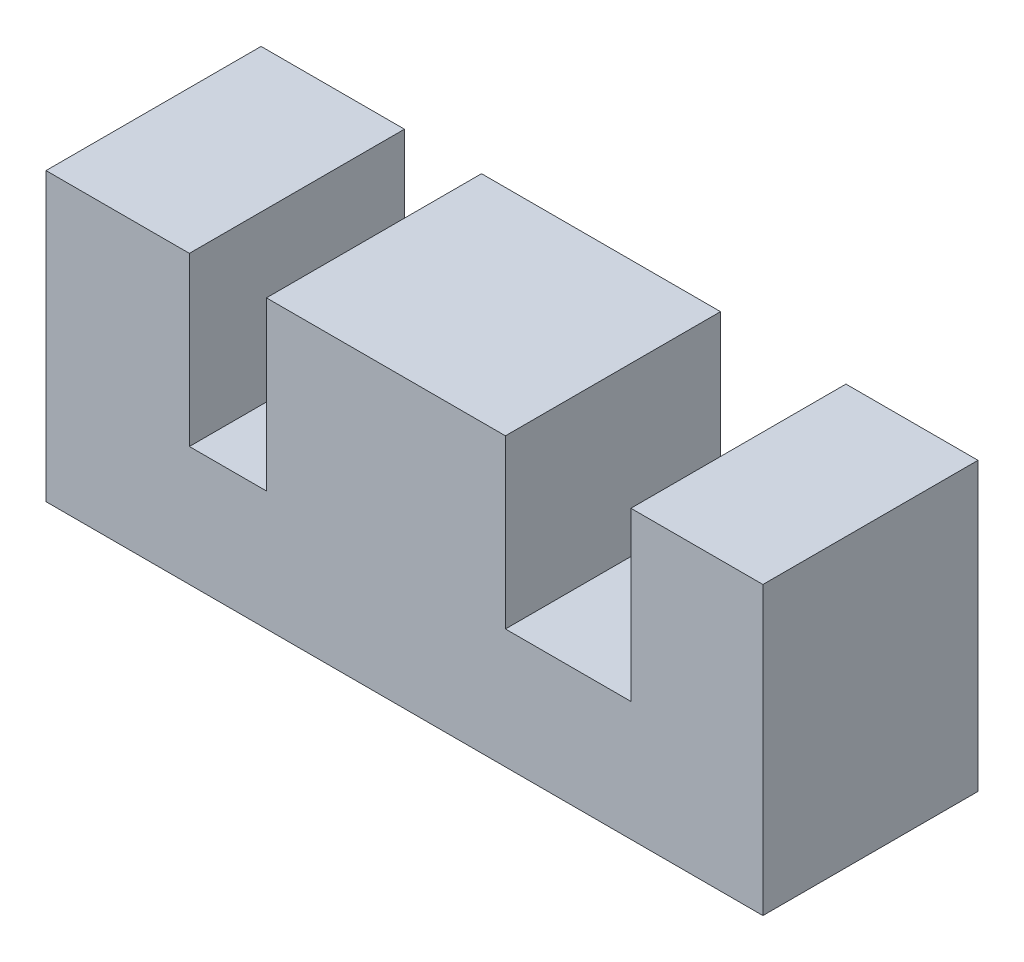
ISO-10303-21;
HEADER;
FILE_DESCRIPTION(('STEP AP214'),'2;1');
FILE_NAME('part.step','',(''),(''),'','','');
FILE_SCHEMA(('AUTOMOTIVE_DESIGN { 1 0 10303 214 1 1 1 1 }'));
ENDSEC;
DATA;
#1=APPLICATION_CONTEXT('core data for automotive mechanical design processes');
#2=APPLICATION_PROTOCOL_DEFINITION('international standard','automotive_design',2000,#1);
#3=PRODUCT_CONTEXT('',#1,'mechanical');
#4=PRODUCT('Part','Part','',(#3));
#5=PRODUCT_RELATED_PRODUCT_CATEGORY('part','',(#4));
#6=PRODUCT_DEFINITION_FORMATION('','',#4);
#7=PRODUCT_DEFINITION_CONTEXT('part definition',#1,'design');
#8=PRODUCT_DEFINITION('design','',#6,#7);
#9=PRODUCT_DEFINITION_SHAPE('','',#8);
#10=(LENGTH_UNIT() NAMED_UNIT(*) SI_UNIT(.MILLI.,.METRE.));
#11=(NAMED_UNIT(*) PLANE_ANGLE_UNIT() SI_UNIT($,.RADIAN.));
#12=(NAMED_UNIT(*) SI_UNIT($,.STERADIAN.) SOLID_ANGLE_UNIT());
#13=UNCERTAINTY_MEASURE_WITH_UNIT(LENGTH_MEASURE(1.E-05),#10,'distance_accuracy_value','');
#14=(GEOMETRIC_REPRESENTATION_CONTEXT(3) GLOBAL_UNCERTAINTY_ASSIGNED_CONTEXT((#13)) GLOBAL_UNIT_ASSIGNED_CONTEXT((#10,
#11,#12)) REPRESENTATION_CONTEXT('',''));
#15=CARTESIAN_POINT('',(0.,0.,0.));
#16=DIRECTION('',(0.,0.,1.));
#17=DIRECTION('',(1.,0.,0.));
#18=AXIS2_PLACEMENT_3D('',#15,#16,#17);
#19=CARTESIAN_POINT('',(0.,10.,0.));
#20=DIRECTION('',(0.,1.,0.));
#21=DIRECTION('',(0.,0.,1.));
#22=AXIS2_PLACEMENT_3D('',#19,#20,#21);
#23=PLANE('',#22);
#24=DIRECTION('',(1.,0.,0.));
#25=VECTOR('',#24,1.);
#26=CARTESIAN_POINT('',(-36.9298245614035,10.,8.21929824561403));
#27=LINE('',#26,#25);
#28=CARTESIAN_POINT('',(1.52017543859649,10.,8.21929824561403));
#29=VERTEX_POINT('',#28);
#30=CARTESIAN_POINT('',(12.0201754385965,10.,8.21929824561403));
#31=VERTEX_POINT('',#30);
#32=EDGE_CURVE('E48',#29,#31,#27,.T.);
#33=ORIENTED_EDGE('',*,*,#32,.T.);
#34=DIRECTION('',(0.,0.,1.));
#35=VECTOR('',#34,1.);
#36=CARTESIAN_POINT('',(12.0201754385965,10.,8.21929824561404));
#37=LINE('',#36,#35);
#38=CARTESIAN_POINT('',(12.0201754385965,10.,-9.78070175438596));
#39=VERTEX_POINT('',#38);
#40=EDGE_CURVE('E148',#39,#31,#37,.T.);
#41=ORIENTED_EDGE('',*,*,#40,.F.);
#42=DIRECTION('',(-1.,0.,0.));
#43=VECTOR('',#42,1.);
#44=CARTESIAN_POINT('',(-36.9298245614035,10.,-9.78070175438596));
#45=LINE('',#44,#43);
#46=CARTESIAN_POINT('',(1.5201754385965,10.,-9.78070175438596));
#47=VERTEX_POINT('',#46);
#48=EDGE_CURVE('E206',#39,#47,#45,.T.);
#49=ORIENTED_EDGE('',*,*,#48,.T.);
#50=DIRECTION('',(0.,0.,-1.));
#51=VECTOR('',#50,1.);
#52=CARTESIAN_POINT('',(1.52017543859649,10.,8.21929824561403));
#53=LINE('',#52,#51);
#54=EDGE_CURVE('E158',#29,#47,#53,.T.);
#55=ORIENTED_EDGE('',*,*,#54,.F.);
#56=EDGE_LOOP('',(#33,#41,#49,#55));
#57=FACE_BOUND('',#56,.T.);
#58=ADVANCED_FACE('F33',(#57),#23,.T.);
#59=CARTESIAN_POINT('',(-24.9298245614035,10.,8.21929824561403));
#60=VERTEX_POINT('',#59);
#61=CARTESIAN_POINT('',(-18.4798245614035,10.,8.21929824561403));
#62=VERTEX_POINT('',#61);
#63=EDGE_CURVE('E203',#60,#62,#27,.T.);
#64=ORIENTED_EDGE('',*,*,#63,.T.);
#65=DIRECTION('',(0.,0.,1.));
#66=VECTOR('',#65,1.);
#67=CARTESIAN_POINT('',(-18.4798245614035,10.,8.21929824561404));
#68=LINE('',#67,#66);
#69=CARTESIAN_POINT('',(-18.4798245614035,10.,-9.78070175438596));
#70=VERTEX_POINT('',#69);
#71=EDGE_CURVE('E56',#70,#62,#68,.T.);
#72=ORIENTED_EDGE('',*,*,#71,.F.);
#73=CARTESIAN_POINT('',(-24.9298245614035,10.,-9.78070175438596));
#74=VERTEX_POINT('',#73);
#75=EDGE_CURVE('E205',#70,#74,#45,.T.);
#76=ORIENTED_EDGE('',*,*,#75,.T.);
#77=DIRECTION('',(0.,0.,-1.));
#78=VECTOR('',#77,1.);
#79=CARTESIAN_POINT('',(-24.9298245614035,10.,8.21929824561403));
#80=LINE('',#79,#78);
#81=EDGE_CURVE('E183',#60,#74,#80,.T.);
#82=ORIENTED_EDGE('',*,*,#81,.F.);
#83=EDGE_LOOP('',(#64,#72,#76,#82));
#84=FACE_BOUND('',#83,.T.);
#85=ADVANCED_FACE('F233',(#84),#23,.T.);
#86=CARTESIAN_POINT('',(-36.9298245614035,10.,-9.78070175438596));
#87=DIRECTION('',(1.,0.,0.));
#88=DIRECTION('',(0.,0.,-1.));
#89=AXIS2_PLACEMENT_3D('',#86,#87,#88);
#90=PLANE('',#89);
#91=DIRECTION('',(0.,0.,1.));
#92=VECTOR('',#91,1.);
#93=CARTESIAN_POINT('',(-36.9298245614035,0.,-9.78070175438596));
#94=LINE('',#93,#92);
#95=CARTESIAN_POINT('',(-36.9298245614035,0.,-9.78070175438596));
#96=VERTEX_POINT('',#95);
#97=CARTESIAN_POINT('',(-36.9298245614035,0.,8.21929824561403));
#98=VERTEX_POINT('',#97);
#99=EDGE_CURVE('E202',#96,#98,#94,.T.);
#100=ORIENTED_EDGE('',*,*,#99,.T.);
#101=DIRECTION('',(0.,-1.,0.));
#102=VECTOR('',#101,1.);
#103=CARTESIAN_POINT('',(-36.9298245614035,10.,8.21929824561403));
#104=LINE('',#103,#102);
#105=CARTESIAN_POINT('',(-36.9298245614035,24.,8.21929824561403));
#106=VERTEX_POINT('',#105);
#107=EDGE_CURVE('E11',#106,#98,#104,.T.);
#108=ORIENTED_EDGE('',*,*,#107,.F.);
#109=DIRECTION('',(0.,0.,1.));
#110=VECTOR('',#109,1.);
#111=CARTESIAN_POINT('',(-36.9298245614035,24.,8.21929824561403));
#112=LINE('',#111,#110);
#113=CARTESIAN_POINT('',(-36.9298245614035,24.,-9.78070175438596));
#114=VERTEX_POINT('',#113);
#115=EDGE_CURVE('E184',#114,#106,#112,.T.);
#116=ORIENTED_EDGE('',*,*,#115,.F.);
#117=DIRECTION('',(0.,-1.,0.));
#118=VECTOR('',#117,1.);
#119=CARTESIAN_POINT('',(-36.9298245614035,10.,-9.78070175438596));
#120=LINE('',#119,#118);
#121=EDGE_CURVE('E133',#114,#96,#120,.T.);
#122=ORIENTED_EDGE('',*,*,#121,.T.);
#123=EDGE_LOOP('',(#100,#108,#116,#122));
#124=FACE_BOUND('',#123,.T.);
#125=ADVANCED_FACE('F35',(#124),#90,.F.);
#126=CARTESIAN_POINT('',(-36.9298245614035,10.,8.21929824561403));
#127=DIRECTION('',(0.,0.,-1.));
#128=DIRECTION('',(-1.,0.,0.));
#129=AXIS2_PLACEMENT_3D('',#126,#127,#128);
#130=PLANE('',#129);
#131=DIRECTION('',(1.,0.,0.));
#132=VECTOR('',#131,1.);
#133=CARTESIAN_POINT('',(-36.9298245614035,0.,8.21929824561403));
#134=LINE('',#133,#132);
#135=CARTESIAN_POINT('',(23.0701754385965,0.,8.21929824561403));
#136=VERTEX_POINT('',#135);
#137=EDGE_CURVE('E210',#98,#136,#134,.T.);
#138=ORIENTED_EDGE('',*,*,#137,.T.);
#139=DIRECTION('',(0.,-1.,0.));
#140=VECTOR('',#139,1.);
#141=CARTESIAN_POINT('',(23.0701754385965,10.,8.21929824561403));
#142=LINE('',#141,#140);
#143=CARTESIAN_POINT('',(23.0701754385965,24.,8.21929824561403));
#144=VERTEX_POINT('',#143);
#145=EDGE_CURVE('E41',#144,#136,#142,.T.);
#146=ORIENTED_EDGE('',*,*,#145,.F.);
#147=DIRECTION('',(1.,0.,0.));
#148=VECTOR('',#147,1.);
#149=CARTESIAN_POINT('',(23.0701754385965,24.,8.21929824561403));
#150=LINE('',#149,#148);
#151=CARTESIAN_POINT('',(12.0201754385965,24.,8.21929824561404));
#152=VERTEX_POINT('',#151);
#153=EDGE_CURVE('E147',#152,#144,#150,.T.);
#154=ORIENTED_EDGE('',*,*,#153,.F.);
#155=DIRECTION('',(0.,-1.,0.));
#156=VECTOR('',#155,1.);
#157=CARTESIAN_POINT('',(12.0201754385965,24.,8.21929824561404));
#158=LINE('',#157,#156);
#159=EDGE_CURVE('E153',#152,#31,#158,.T.);
#160=ORIENTED_EDGE('',*,*,#159,.T.);
#161=ORIENTED_EDGE('',*,*,#32,.F.);
#162=DIRECTION('',(0.,-1.,0.));
#163=VECTOR('',#162,1.);
#164=CARTESIAN_POINT('',(1.52017543859649,24.,8.21929824561403));
#165=LINE('',#164,#163);
#166=CARTESIAN_POINT('',(1.52017543859649,24.,8.21929824561403));
#167=VERTEX_POINT('',#166);
#168=EDGE_CURVE('E168',#167,#29,#165,.T.);
#169=ORIENTED_EDGE('',*,*,#168,.F.);
#170=DIRECTION('',(1.,0.,0.));
#171=VECTOR('',#170,1.);
#172=CARTESIAN_POINT('',(1.52017543859649,24.,8.21929824561403));
#173=LINE('',#172,#171);
#174=CARTESIAN_POINT('',(-18.4798245614035,24.,8.21929824561404));
#175=VERTEX_POINT('',#174);
#176=EDGE_CURVE('E166',#175,#167,#173,.T.);
#177=ORIENTED_EDGE('',*,*,#176,.F.);
#178=DIRECTION('',(0.,-1.,0.));
#179=VECTOR('',#178,1.);
#180=CARTESIAN_POINT('',(-18.4798245614035,24.,8.21929824561404));
#181=LINE('',#180,#179);
#182=EDGE_CURVE('E174',#175,#62,#181,.T.);
#183=ORIENTED_EDGE('',*,*,#182,.T.);
#184=ORIENTED_EDGE('',*,*,#63,.F.);
#185=DIRECTION('',(0.,-1.,0.));
#186=VECTOR('',#185,1.);
#187=CARTESIAN_POINT('',(-24.9298245614035,24.,8.21929824561403));
#188=LINE('',#187,#186);
#189=CARTESIAN_POINT('',(-24.9298245614035,24.,8.21929824561403));
#190=VERTEX_POINT('',#189);
#191=EDGE_CURVE('E199',#190,#60,#188,.T.);
#192=ORIENTED_EDGE('',*,*,#191,.F.);
#193=DIRECTION('',(1.,0.,0.));
#194=VECTOR('',#193,1.);
#195=CARTESIAN_POINT('',(-36.9298245614035,24.,8.21929824561403));
#196=LINE('',#195,#194);
#197=EDGE_CURVE('E187',#106,#190,#196,.T.);
#198=ORIENTED_EDGE('',*,*,#197,.F.);
#199=ORIENTED_EDGE('',*,*,#107,.T.);
#200=EDGE_LOOP('',(#138,#146,#154,#160,#161,#169,#177,#183,#184,#192,#198,#199));
#201=FACE_BOUND('',#200,.T.);
#202=ADVANCED_FACE('F234',(#201),#130,.F.);
#203=CARTESIAN_POINT('',(23.0701754385965,10.,-9.78070175438596));
#204=DIRECTION('',(-1.,0.,0.));
#205=DIRECTION('',(0.,0.,1.));
#206=AXIS2_PLACEMENT_3D('',#203,#204,#205);
#207=PLANE('',#206);
#208=DIRECTION('',(0.,0.,-1.));
#209=VECTOR('',#208,1.);
#210=CARTESIAN_POINT('',(23.0701754385965,0.,-9.78070175438596));
#211=LINE('',#210,#209);
#212=CARTESIAN_POINT('',(23.0701754385965,0.,-9.78070175438596));
#213=VERTEX_POINT('',#212);
#214=EDGE_CURVE('E130',#136,#213,#211,.T.);
#215=ORIENTED_EDGE('',*,*,#214,.T.);
#216=DIRECTION('',(0.,-1.,0.));
#217=VECTOR('',#216,1.);
#218=CARTESIAN_POINT('',(23.0701754385965,10.,-9.78070175438596));
#219=LINE('',#218,#217);
#220=CARTESIAN_POINT('',(23.0701754385965,24.,-9.78070175438596));
#221=VERTEX_POINT('',#220);
#222=EDGE_CURVE('E123',#221,#213,#219,.T.);
#223=ORIENTED_EDGE('',*,*,#222,.F.);
#224=DIRECTION('',(0.,0.,-1.));
#225=VECTOR('',#224,1.);
#226=CARTESIAN_POINT('',(23.0701754385965,24.,8.21929824561403));
#227=LINE('',#226,#225);
#228=EDGE_CURVE('E128',#144,#221,#227,.T.);
#229=ORIENTED_EDGE('',*,*,#228,.F.);
#230=ORIENTED_EDGE('',*,*,#145,.T.);
#231=EDGE_LOOP('',(#215,#223,#229,#230));
#232=FACE_BOUND('',#231,.T.);
#233=ADVANCED_FACE('F125',(#232),#207,.F.);
#234=CARTESIAN_POINT('',(-36.9298245614035,10.,-9.78070175438596));
#235=DIRECTION('',(0.,0.,1.));
#236=DIRECTION('',(1.,0.,0.));
#237=AXIS2_PLACEMENT_3D('',#234,#235,#236);
#238=PLANE('',#237);
#239=DIRECTION('',(-1.,0.,0.));
#240=VECTOR('',#239,1.);
#241=CARTESIAN_POINT('',(-36.9298245614035,0.,-9.78070175438596));
#242=LINE('',#241,#240);
#243=EDGE_CURVE('E213',#213,#96,#242,.T.);
#244=ORIENTED_EDGE('',*,*,#243,.T.);
#245=ORIENTED_EDGE('',*,*,#121,.F.);
#246=DIRECTION('',(-1.,0.,0.));
#247=VECTOR('',#246,1.);
#248=CARTESIAN_POINT('',(-36.9298245614035,24.,-9.78070175438596));
#249=LINE('',#248,#247);
#250=CARTESIAN_POINT('',(-24.9298245614035,24.,-9.78070175438596));
#251=VERTEX_POINT('',#250);
#252=EDGE_CURVE('E191',#251,#114,#249,.T.);
#253=ORIENTED_EDGE('',*,*,#252,.F.);
#254=DIRECTION('',(0.,-1.,0.));
#255=VECTOR('',#254,1.);
#256=CARTESIAN_POINT('',(-24.9298245614035,24.,-9.78070175438596));
#257=LINE('',#256,#255);
#258=EDGE_CURVE('E194',#251,#74,#257,.T.);
#259=ORIENTED_EDGE('',*,*,#258,.T.);
#260=ORIENTED_EDGE('',*,*,#75,.F.);
#261=DIRECTION('',(0.,-1.,0.));
#262=VECTOR('',#261,1.);
#263=CARTESIAN_POINT('',(-18.4798245614035,24.,-9.78070175438596));
#264=LINE('',#263,#262);
#265=CARTESIAN_POINT('',(-18.4798245614035,24.,-9.78070175438596));
#266=VERTEX_POINT('',#265);
#267=EDGE_CURVE('E177',#266,#70,#264,.T.);
#268=ORIENTED_EDGE('',*,*,#267,.F.);
#269=DIRECTION('',(-1.,0.,0.));
#270=VECTOR('',#269,1.);
#271=CARTESIAN_POINT('',(1.5201754385965,24.,-9.78070175438596));
#272=LINE('',#271,#270);
#273=CARTESIAN_POINT('',(1.5201754385965,24.,-9.78070175438596));
#274=VERTEX_POINT('',#273);
#275=EDGE_CURVE('E162',#274,#266,#272,.T.);
#276=ORIENTED_EDGE('',*,*,#275,.F.);
#277=DIRECTION('',(0.,-1.,0.));
#278=VECTOR('',#277,1.);
#279=CARTESIAN_POINT('',(1.5201754385965,24.,-9.78070175438596));
#280=LINE('',#279,#278);
#281=EDGE_CURVE('E180',#274,#47,#280,.T.);
#282=ORIENTED_EDGE('',*,*,#281,.T.);
#283=ORIENTED_EDGE('',*,*,#48,.F.);
#284=DIRECTION('',(0.,-1.,0.));
#285=VECTOR('',#284,1.);
#286=CARTESIAN_POINT('',(12.0201754385965,24.,-9.78070175438596));
#287=LINE('',#286,#285);
#288=CARTESIAN_POINT('',(12.0201754385965,24.,-9.78070175438596));
#289=VERTEX_POINT('',#288);
#290=EDGE_CURVE('E139',#289,#39,#287,.T.);
#291=ORIENTED_EDGE('',*,*,#290,.F.);
#292=DIRECTION('',(-1.,0.,0.));
#293=VECTOR('',#292,1.);
#294=CARTESIAN_POINT('',(23.0701754385965,24.,-9.78070175438596));
#295=LINE('',#294,#293);
#296=EDGE_CURVE('E136',#221,#289,#295,.T.);
#297=ORIENTED_EDGE('',*,*,#296,.F.);
#298=ORIENTED_EDGE('',*,*,#222,.T.);
#299=EDGE_LOOP('',(#244,#245,#253,#259,#260,#268,#276,#282,#283,#291,#297,#298));
#300=FACE_BOUND('',#299,.T.);
#301=ADVANCED_FACE('F137',(#300),#238,.F.);
#302=CARTESIAN_POINT('',(0.,0.,0.));
#303=DIRECTION('',(0.,1.,0.));
#304=DIRECTION('',(0.,0.,1.));
#305=AXIS2_PLACEMENT_3D('',#302,#303,#304);
#306=PLANE('',#305);
#307=ORIENTED_EDGE('',*,*,#99,.F.);
#308=ORIENTED_EDGE('',*,*,#243,.F.);
#309=ORIENTED_EDGE('',*,*,#214,.F.);
#310=ORIENTED_EDGE('',*,*,#137,.F.);
#311=EDGE_LOOP('',(#307,#308,#309,#310));
#312=FACE_BOUND('',#311,.T.);
#313=ADVANCED_FACE('F219',(#312),#306,.F.);
#314=CARTESIAN_POINT('',(-24.9298245614035,24.,8.21929824561403));
#315=DIRECTION('',(-1.,0.,0.));
#316=DIRECTION('',(0.,0.,1.));
#317=AXIS2_PLACEMENT_3D('',#314,#315,#316);
#318=PLANE('',#317);
#319=ORIENTED_EDGE('',*,*,#81,.T.);
#320=ORIENTED_EDGE('',*,*,#258,.F.);
#321=DIRECTION('',(0.,0.,-1.));
#322=VECTOR('',#321,1.);
#323=CARTESIAN_POINT('',(-24.9298245614035,24.,8.21929824561403));
#324=LINE('',#323,#322);
#325=EDGE_CURVE('E189',#190,#251,#324,.T.);
#326=ORIENTED_EDGE('',*,*,#325,.F.);
#327=ORIENTED_EDGE('',*,*,#191,.T.);
#328=EDGE_LOOP('',(#319,#320,#326,#327));
#329=FACE_BOUND('',#328,.T.);
#330=ADVANCED_FACE('F231',(#329),#318,.F.);
#331=CARTESIAN_POINT('',(0.,24.,0.));
#332=DIRECTION('',(0.,-1.,0.));
#333=DIRECTION('',(0.,0.,-1.));
#334=AXIS2_PLACEMENT_3D('',#331,#332,#333);
#335=PLANE('',#334);
#336=ORIENTED_EDGE('',*,*,#115,.T.);
#337=ORIENTED_EDGE('',*,*,#197,.T.);
#338=ORIENTED_EDGE('',*,*,#325,.T.);
#339=ORIENTED_EDGE('',*,*,#252,.T.);
#340=EDGE_LOOP('',(#336,#337,#338,#339));
#341=FACE_BOUND('',#340,.T.);
#342=ADVANCED_FACE('F225',(#341),#335,.F.);
#343=CARTESIAN_POINT('',(1.52017543859649,24.,8.21929824561403));
#344=DIRECTION('',(-1.,0.,0.));
#345=DIRECTION('',(0.,0.,1.));
#346=AXIS2_PLACEMENT_3D('',#343,#344,#345);
#347=PLANE('',#346);
#348=ORIENTED_EDGE('',*,*,#54,.T.);
#349=ORIENTED_EDGE('',*,*,#281,.F.);
#350=DIRECTION('',(0.,0.,-1.));
#351=VECTOR('',#350,1.);
#352=CARTESIAN_POINT('',(1.52017543859649,24.,8.21929824561403));
#353=LINE('',#352,#351);
#354=EDGE_CURVE('E159',#167,#274,#353,.T.);
#355=ORIENTED_EDGE('',*,*,#354,.F.);
#356=ORIENTED_EDGE('',*,*,#168,.T.);
#357=EDGE_LOOP('',(#348,#349,#355,#356));
#358=FACE_BOUND('',#357,.T.);
#359=ADVANCED_FACE('F246',(#358),#347,.F.);
#360=CARTESIAN_POINT('',(-18.4798245614035,24.,8.21929824561404));
#361=DIRECTION('',(1.,0.,0.));
#362=DIRECTION('',(0.,0.,-1.));
#363=AXIS2_PLACEMENT_3D('',#360,#361,#362);
#364=PLANE('',#363);
#365=ORIENTED_EDGE('',*,*,#71,.T.);
#366=ORIENTED_EDGE('',*,*,#182,.F.);
#367=DIRECTION('',(0.,0.,1.));
#368=VECTOR('',#367,1.);
#369=CARTESIAN_POINT('',(-18.4798245614035,24.,8.21929824561404));
#370=LINE('',#369,#368);
#371=EDGE_CURVE('E164',#266,#175,#370,.T.);
#372=ORIENTED_EDGE('',*,*,#371,.F.);
#373=ORIENTED_EDGE('',*,*,#267,.T.);
#374=EDGE_LOOP('',(#365,#366,#372,#373));
#375=FACE_BOUND('',#374,.T.);
#376=ADVANCED_FACE('F240',(#375),#364,.F.);
#377=CARTESIAN_POINT('',(0.,24.,0.));
#378=DIRECTION('',(0.,1.,0.));
#379=DIRECTION('',(0.,0.,1.));
#380=AXIS2_PLACEMENT_3D('',#377,#378,#379);
#381=PLANE('',#380);
#382=ORIENTED_EDGE('',*,*,#354,.T.);
#383=ORIENTED_EDGE('',*,*,#275,.T.);
#384=ORIENTED_EDGE('',*,*,#371,.T.);
#385=ORIENTED_EDGE('',*,*,#176,.T.);
#386=EDGE_LOOP('',(#382,#383,#384,#385));
#387=FACE_BOUND('',#386,.T.);
#388=ADVANCED_FACE('F244',(#387),#381,.T.);
#389=CARTESIAN_POINT('',(12.0201754385965,24.,8.21929824561404));
#390=DIRECTION('',(1.,0.,0.));
#391=DIRECTION('',(0.,0.,-1.));
#392=AXIS2_PLACEMENT_3D('',#389,#390,#391);
#393=PLANE('',#392);
#394=ORIENTED_EDGE('',*,*,#40,.T.);
#395=ORIENTED_EDGE('',*,*,#159,.F.);
#396=DIRECTION('',(0.,0.,1.));
#397=VECTOR('',#396,1.);
#398=CARTESIAN_POINT('',(12.0201754385965,24.,8.21929824561404));
#399=LINE('',#398,#397);
#400=EDGE_CURVE('E142',#289,#152,#399,.T.);
#401=ORIENTED_EDGE('',*,*,#400,.F.);
#402=ORIENTED_EDGE('',*,*,#290,.T.);
#403=EDGE_LOOP('',(#394,#395,#401,#402));
#404=FACE_BOUND('',#403,.T.);
#405=ADVANCED_FACE('F249',(#404),#393,.F.);
#406=CARTESIAN_POINT('',(0.,24.,0.));
#407=DIRECTION('',(0.,1.,0.));
#408=DIRECTION('',(0.,0.,1.));
#409=AXIS2_PLACEMENT_3D('',#406,#407,#408);
#410=PLANE('',#409);
#411=ORIENTED_EDGE('',*,*,#228,.T.);
#412=ORIENTED_EDGE('',*,*,#296,.T.);
#413=ORIENTED_EDGE('',*,*,#400,.T.);
#414=ORIENTED_EDGE('',*,*,#153,.T.);
#415=EDGE_LOOP('',(#411,#412,#413,#414));
#416=FACE_BOUND('',#415,.T.);
#417=ADVANCED_FACE('F145',(#416),#410,.T.);
#418=CLOSED_SHELL('',(#58,#85,#125,#202,#233,#301,#313,#330,#342,#359,#376,#388,#405,#417));
#419=MANIFOLD_SOLID_BREP('B2',#418);
#420=ADVANCED_BREP_SHAPE_REPRESENTATION('',(#18,#419),#14);
#421=SHAPE_DEFINITION_REPRESENTATION(#9,#420);
ENDSEC;
END-ISO-10303-21;
